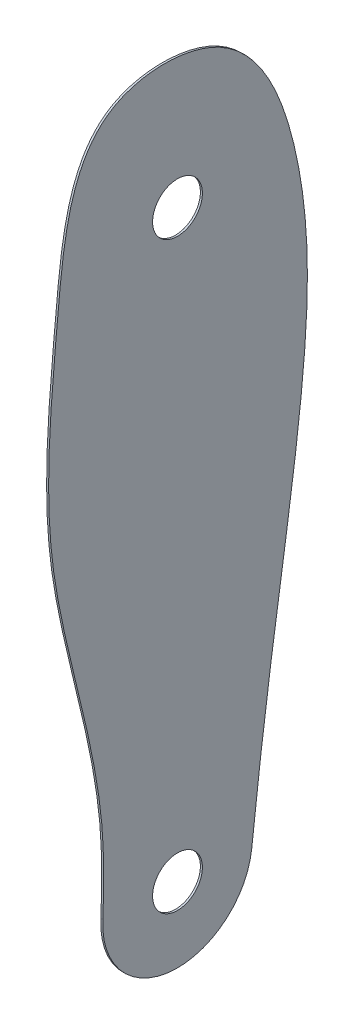
ISO-10303-21;
HEADER;
FILE_DESCRIPTION(('STEP AP214'),'2;1');
FILE_NAME('part.step','',(''),(''),'','','');
FILE_SCHEMA(('AUTOMOTIVE_DESIGN { 1 0 10303 214 1 1 1 1 }'));
ENDSEC;
DATA;
#1=APPLICATION_CONTEXT('core data for automotive mechanical design processes');
#2=APPLICATION_PROTOCOL_DEFINITION('international standard','automotive_design',2000,#1);
#3=PRODUCT_CONTEXT('',#1,'mechanical');
#4=PRODUCT('Part','Part','',(#3));
#5=PRODUCT_RELATED_PRODUCT_CATEGORY('part','',(#4));
#6=PRODUCT_DEFINITION_FORMATION('','',#4);
#7=PRODUCT_DEFINITION_CONTEXT('part definition',#1,'design');
#8=PRODUCT_DEFINITION('design','',#6,#7);
#9=PRODUCT_DEFINITION_SHAPE('','',#8);
#10=(LENGTH_UNIT() NAMED_UNIT(*) SI_UNIT(.MILLI.,.METRE.));
#11=(NAMED_UNIT(*) PLANE_ANGLE_UNIT() SI_UNIT($,.RADIAN.));
#12=(NAMED_UNIT(*) SI_UNIT($,.STERADIAN.) SOLID_ANGLE_UNIT());
#13=UNCERTAINTY_MEASURE_WITH_UNIT(LENGTH_MEASURE(1.E-05),#10,'distance_accuracy_value','');
#14=(GEOMETRIC_REPRESENTATION_CONTEXT(3) GLOBAL_UNCERTAINTY_ASSIGNED_CONTEXT((#13)) GLOBAL_UNIT_ASSIGNED_CONTEXT((#10,
#11,#12)) REPRESENTATION_CONTEXT('',''));
#15=CARTESIAN_POINT('',(0.,0.,0.));
#16=DIRECTION('',(0.,0.,1.));
#17=DIRECTION('',(1.,0.,0.));
#18=AXIS2_PLACEMENT_3D('',#15,#16,#17);
#19=CARTESIAN_POINT('',(0.5,65.5101613878773,0.554919069217134));
#20=DIRECTION('',(1.,0.,0.));
#21=DIRECTION('',(0.,0.,-1.));
#22=AXIS2_PLACEMENT_3D('',#19,#20,#21);
#23=PLANE('',#22);
#24=CARTESIAN_POINT('',(0.5,-293.,0.));
#25=DIRECTION('',(1.,0.,0.));
#26=DIRECTION('',(0.,0.,-1.));
#27=AXIS2_PLACEMENT_3D('',#24,#25,#26);
#28=CIRCLE('',#27,12.5);
#29=CARTESIAN_POINT('',(0.5,-293.,-12.5));
#30=VERTEX_POINT('',#29);
#31=EDGE_CURVE('E73',#30,#30,#28,.T.);
#32=ORIENTED_EDGE('',*,*,#31,.F.);
#33=EDGE_LOOP('',(#32));
#34=FACE_BOUND('',#33,.T.);
#35=CARTESIAN_POINT('',(0.5,-297.075477828261,-37.2778819204009));
#36=CARTESIAN_POINT('',(0.5,-269.578003475828,-40.2840974370394));
#37=CARTESIAN_POINT('',(0.5,-206.902879940062,-48.3743749260615));
#38=CARTESIAN_POINT('',(0.5,-109.504452760533,-64.6436177076725));
#39=CARTESIAN_POINT('',(0.5,-15.6662066546028,-68.2090914638696));
#40=CARTESIAN_POINT('',(0.5,68.1237122690443,-34.6363354477701));
#41=CARTESIAN_POINT('',(0.5,67.1807775028716,52.0626457108523));
#42=CARTESIAN_POINT('',(0.5,-30.5674186027018,61.3627851510112));
#43=CARTESIAN_POINT('',(0.5,-131.055654485421,70.9282451451036));
#44=CARTESIAN_POINT('',(0.5,-222.609182538237,35.6979668532105));
#45=CARTESIAN_POINT('',(0.5,-278.999108272036,37.0847983974244));
#46=CARTESIAN_POINT('',(0.5,-290.764459076279,37.4333054482017));
#47=B_SPLINE_CURVE_WITH_KNOTS('',3,(#35,#36,#37,#38,#39,#40,#41,#42,#43,#44,#45,#46),
.UNSPECIFIED.,.F.,.F.,(4,1,1,1,1,1,1,1,1,4),(0.,0.106321263954958,0.242882867771733,
0.3759949784838,0.475518512720295,0.539537242167306,0.641839757084407,0.780820508216556,
0.952014365828108,0.997141788274807),.UNSPECIFIED.);
#48=CARTESIAN_POINT('',(0.5,-297.075477828261,-37.2778819204009));
#49=VERTEX_POINT('',#48);
#50=CARTESIAN_POINT('',(0.5,-290.764459076279,37.4333054482017));
#51=VERTEX_POINT('',#50);
#52=EDGE_CURVE('E67',#49,#51,#47,.T.);
#53=ORIENTED_EDGE('',*,*,#52,.T.);
#54=CARTESIAN_POINT('',(0.5,-293.,0.));
#55=DIRECTION('',(1.,0.,0.));
#56=DIRECTION('',(0.,0.,-1.));
#57=AXIS2_PLACEMENT_3D('',#54,#55,#56);
#58=CIRCLE('',#57,37.5);
#59=EDGE_CURVE('E52',#51,#49,#58,.T.);
#60=ORIENTED_EDGE('',*,*,#59,.T.);
#61=EDGE_LOOP('',(#53,#60));
#62=FACE_BOUND('',#61,.T.);
#63=CARTESIAN_POINT('',(0.5,0.,0.));
#64=DIRECTION('',(1.,0.,0.));
#65=DIRECTION('',(0.,0.,-1.));
#66=AXIS2_PLACEMENT_3D('',#63,#64,#65);
#67=CIRCLE('',#66,12.5);
#68=CARTESIAN_POINT('',(0.5,0.,-12.5));
#69=VERTEX_POINT('',#68);
#70=EDGE_CURVE('E92',#69,#69,#67,.T.);
#71=ORIENTED_EDGE('',*,*,#70,.F.);
#72=EDGE_LOOP('',(#71));
#73=FACE_BOUND('',#72,.T.);
#74=ADVANCED_FACE('F35',(#34,#62,#73),#23,.T.);
#75=CARTESIAN_POINT('',(-0.5,65.5101613878773,0.554919069217134));
#76=DIRECTION('',(1.,0.,0.));
#77=DIRECTION('',(0.,0.,-1.));
#78=AXIS2_PLACEMENT_3D('',#75,#76,#77);
#79=PLANE('',#78);
#80=CARTESIAN_POINT('',(-0.5,-297.075477828261,-37.2778819204009));
#81=CARTESIAN_POINT('',(-0.5,-269.578003475828,-40.2840974370394));
#82=CARTESIAN_POINT('',(-0.5,-206.902879940062,-48.3743749260615));
#83=CARTESIAN_POINT('',(-0.5,-109.504452760533,-64.6436177076725));
#84=CARTESIAN_POINT('',(-0.5,-15.6662066546028,-68.2090914638696));
#85=CARTESIAN_POINT('',(-0.5,68.1237122690443,-34.6363354477701));
#86=CARTESIAN_POINT('',(-0.5,67.1807775028716,52.0626457108523));
#87=CARTESIAN_POINT('',(-0.5,-30.5674186027018,61.3627851510112));
#88=CARTESIAN_POINT('',(-0.5,-131.055654485421,70.9282451451036));
#89=CARTESIAN_POINT('',(-0.5,-222.609182538237,35.6979668532105));
#90=CARTESIAN_POINT('',(-0.5,-278.999108272036,37.0847983974244));
#91=CARTESIAN_POINT('',(-0.5,-290.764459076279,37.4333054482017));
#92=B_SPLINE_CURVE_WITH_KNOTS('',3,(#80,#81,#82,#83,#84,#85,#86,#87,#88,#89,#90,#91),
.UNSPECIFIED.,.F.,.F.,(4,1,1,1,1,1,1,1,1,4),(0.,0.106321263954958,0.242882867771733,
0.3759949784838,0.475518512720295,0.539537242167306,0.641839757084407,0.780820508216556,
0.952014365828108,0.997141788274807),.UNSPECIFIED.);
#93=CARTESIAN_POINT('',(-0.5,-297.075477828261,-37.2778819204009));
#94=VERTEX_POINT('',#93);
#95=CARTESIAN_POINT('',(-0.5,-290.764459076279,37.4333054482017));
#96=VERTEX_POINT('',#95);
#97=EDGE_CURVE('E68',#94,#96,#92,.T.);
#98=ORIENTED_EDGE('',*,*,#97,.F.);
#99=CARTESIAN_POINT('',(-0.5,-293.,0.));
#100=DIRECTION('',(1.,0.,0.));
#101=DIRECTION('',(0.,0.,-1.));
#102=AXIS2_PLACEMENT_3D('',#99,#100,#101);
#103=CIRCLE('',#102,37.5);
#104=EDGE_CURVE('E60',#96,#94,#103,.T.);
#105=ORIENTED_EDGE('',*,*,#104,.F.);
#106=EDGE_LOOP('',(#98,#105));
#107=FACE_BOUND('',#106,.T.);
#108=CARTESIAN_POINT('',(-0.5,-293.,0.));
#109=DIRECTION('',(1.,0.,0.));
#110=DIRECTION('',(0.,0.,-1.));
#111=AXIS2_PLACEMENT_3D('',#108,#109,#110);
#112=CIRCLE('',#111,12.5);
#113=CARTESIAN_POINT('',(-0.5,-293.,-12.5));
#114=VERTEX_POINT('',#113);
#115=EDGE_CURVE('E76',#114,#114,#112,.T.);
#116=ORIENTED_EDGE('',*,*,#115,.T.);
#117=EDGE_LOOP('',(#116));
#118=FACE_BOUND('',#117,.T.);
#119=CARTESIAN_POINT('',(-0.5,0.,0.));
#120=DIRECTION('',(1.,0.,0.));
#121=DIRECTION('',(0.,0.,-1.));
#122=AXIS2_PLACEMENT_3D('',#119,#120,#121);
#123=CIRCLE('',#122,12.5);
#124=CARTESIAN_POINT('',(-0.5,0.,-12.5));
#125=VERTEX_POINT('',#124);
#126=EDGE_CURVE('E94',#125,#125,#123,.T.);
#127=ORIENTED_EDGE('',*,*,#126,.T.);
#128=EDGE_LOOP('',(#127));
#129=FACE_BOUND('',#128,.T.);
#130=ADVANCED_FACE('F71',(#107,#118,#129),#79,.F.);
#131=DIRECTION('',(-1.,0.,0.));
#132=VECTOR('',#131,1.);
#133=SURFACE_OF_LINEAR_EXTRUSION('',#47,#132);
#134=ORIENTED_EDGE('',*,*,#97,.T.);
#135=DIRECTION('',(-1.,0.,0.));
#136=VECTOR('',#135,1.);
#137=CARTESIAN_POINT('',(0.5,-290.764459076279,37.4333054482017));
#138=LINE('',#137,#136);
#139=EDGE_CURVE('E11',#51,#96,#138,.T.);
#140=ORIENTED_EDGE('',*,*,#139,.F.);
#141=ORIENTED_EDGE('',*,*,#52,.F.);
#142=DIRECTION('',(-1.,0.,0.));
#143=VECTOR('',#142,1.);
#144=CARTESIAN_POINT('',(0.5,-297.075477828261,-37.2778819204009));
#145=LINE('',#144,#143);
#146=EDGE_CURVE('E45',#49,#94,#145,.T.);
#147=ORIENTED_EDGE('',*,*,#146,.T.);
#148=EDGE_LOOP('',(#134,#140,#141,#147));
#149=FACE_BOUND('',#148,.T.);
#150=ADVANCED_FACE('F37',(#149),#133,.F.);
#151=CARTESIAN_POINT('',(0.5,-293.,0.));
#152=DIRECTION('',(-1.,0.,0.));
#153=DIRECTION('',(0.,0.,1.));
#154=AXIS2_PLACEMENT_3D('',#151,#152,#153);
#155=CYLINDRICAL_SURFACE('',#154,37.5);
#156=ORIENTED_EDGE('',*,*,#104,.T.);
#157=ORIENTED_EDGE('',*,*,#146,.F.);
#158=ORIENTED_EDGE('',*,*,#59,.F.);
#159=ORIENTED_EDGE('',*,*,#139,.T.);
#160=EDGE_LOOP('',(#156,#157,#158,#159));
#161=FACE_BOUND('',#160,.T.);
#162=ADVANCED_FACE('F63',(#161),#155,.T.);
#163=CARTESIAN_POINT('',(0.5,-293.,0.));
#164=DIRECTION('',(-1.,0.,0.));
#165=DIRECTION('',(0.,0.,1.));
#166=AXIS2_PLACEMENT_3D('',#163,#164,#165);
#167=CYLINDRICAL_SURFACE('',#166,12.5);
#168=ORIENTED_EDGE('',*,*,#31,.T.);
#169=EDGE_LOOP('',(#168));
#170=FACE_BOUND('',#169,.T.);
#171=ORIENTED_EDGE('',*,*,#115,.F.);
#172=EDGE_LOOP('',(#171));
#173=FACE_BOUND('',#172,.T.);
#174=ADVANCED_FACE('F112',(#170,#173),#167,.F.);
#175=CARTESIAN_POINT('',(0.5,0.,0.));
#176=DIRECTION('',(-1.,0.,0.));
#177=DIRECTION('',(0.,0.,1.));
#178=AXIS2_PLACEMENT_3D('',#175,#176,#177);
#179=CYLINDRICAL_SURFACE('',#178,12.5);
#180=ORIENTED_EDGE('',*,*,#70,.T.);
#181=EDGE_LOOP('',(#180));
#182=FACE_BOUND('',#181,.T.);
#183=ORIENTED_EDGE('',*,*,#126,.F.);
#184=EDGE_LOOP('',(#183));
#185=FACE_BOUND('',#184,.T.);
#186=ADVANCED_FACE('F100',(#182,#185),#179,.F.);
#187=CLOSED_SHELL('',(#74,#130,#150,#162,#174,#186));
#188=MANIFOLD_SOLID_BREP('B2',#187);
#189=ADVANCED_BREP_SHAPE_REPRESENTATION('',(#18,#188),#14);
#190=SHAPE_DEFINITION_REPRESENTATION(#9,#189);
ENDSEC;
END-ISO-10303-21;
